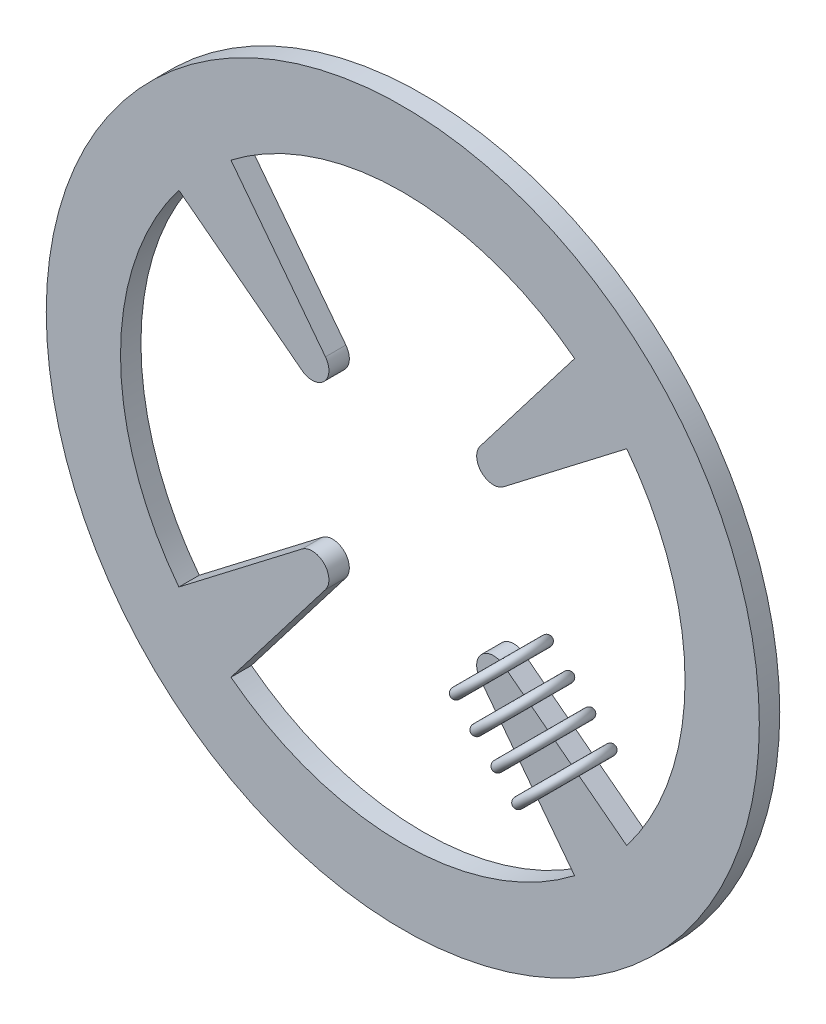
ISO-10303-21;
HEADER;
FILE_DESCRIPTION(('STEP AP214'),'2;1');
FILE_NAME('part.step','',(''),(''),'','','');
FILE_SCHEMA(('AUTOMOTIVE_DESIGN { 1 0 10303 214 1 1 1 1 }'));
ENDSEC;
DATA;
#1=APPLICATION_CONTEXT('core data for automotive mechanical design processes');
#2=APPLICATION_PROTOCOL_DEFINITION('international standard','automotive_design',2000,#1);
#3=PRODUCT_CONTEXT('',#1,'mechanical');
#4=PRODUCT('Part','Part','',(#3));
#5=PRODUCT_RELATED_PRODUCT_CATEGORY('part','',(#4));
#6=PRODUCT_DEFINITION_FORMATION('','',#4);
#7=PRODUCT_DEFINITION_CONTEXT('part definition',#1,'design');
#8=PRODUCT_DEFINITION('design','',#6,#7);
#9=PRODUCT_DEFINITION_SHAPE('','',#8);
#10=(LENGTH_UNIT() NAMED_UNIT(*) SI_UNIT(.MILLI.,.METRE.));
#11=(NAMED_UNIT(*) PLANE_ANGLE_UNIT() SI_UNIT($,.RADIAN.));
#12=(NAMED_UNIT(*) SI_UNIT($,.STERADIAN.) SOLID_ANGLE_UNIT());
#13=UNCERTAINTY_MEASURE_WITH_UNIT(LENGTH_MEASURE(1.E-05),#10,'distance_accuracy_value','');
#14=(GEOMETRIC_REPRESENTATION_CONTEXT(3) GLOBAL_UNCERTAINTY_ASSIGNED_CONTEXT((#13)) GLOBAL_UNIT_ASSIGNED_CONTEXT((#10,
#11,#12)) REPRESENTATION_CONTEXT('',''));
#15=CARTESIAN_POINT('',(0.,0.,0.));
#16=DIRECTION('',(0.,0.,1.));
#17=DIRECTION('',(1.,0.,0.));
#18=AXIS2_PLACEMENT_3D('',#15,#16,#17);
#19=CARTESIAN_POINT('',(0.410121933062218,-0.410121933114174,0.0300000000095224));
#20=DIRECTION('',(0.707106781186549,-0.707106781186546,0.));
#21=DIRECTION('',(0.707106781186546,0.707106781186549,0.));
#22=AXIS2_PLACEMENT_3D('',#19,#20,#21);
#23=TOROIDAL_SURFACE('',#22,0.100656984994382,0.0132);
#24=CARTESIAN_POINT('',(0.481297169725538,-0.338946696450854,0.03));
#25=DIRECTION('',(0.,0.,1.));
#26=DIRECTION('',(1.,0.,0.));
#27=AXIS2_PLACEMENT_3D('',#24,#25,#26);
#28=CIRCLE('',#27,0.0132);
#29=CARTESIAN_POINT('',(0.4906309792372,-0.329612886939192,0.0299999999987512));
#30=VERTEX_POINT('',#29);
#31=EDGE_CURVE('E11',#30,#30,#28,.T.);
#32=CARTESIAN_POINT('',(0.410121933062218,-0.410121933114174,0.0300000000095224));
#33=DIRECTION('',(0.707106781186549,-0.707106781186546,0.));
#34=DIRECTION('',(0.707106781186546,0.707106781186549,0.));
#35=AXIS2_PLACEMENT_3D('',#32,#33,#34);
#36=CIRCLE('',#35,0.113856984994382);
#37=EDGE_CURVE('',#30,#30,#36,.T.);
#38=ORIENTED_EDGE('',*,*,#31,.T.);
#39=ORIENTED_EDGE('',*,*,#31,.F.);
#40=ORIENTED_EDGE('',*,*,#37,.T.);
#41=ORIENTED_EDGE('',*,*,#37,.F.);
#42=EDGE_LOOP('',(#38,#40,#39,#41));
#43=FACE_BOUND('',#42,.T.);
#44=ADVANCED_FACE('F54',(#43),#23,.T.);
#45=CLOSED_SHELL('',(#44));
#46=MANIFOLD_SOLID_BREP('B2',#45);
#47=CARTESIAN_POINT('',(0.29698484809835,-0.296984848098347,0.03));
#48=DIRECTION('',(0.707106781186549,-0.707106781186546,0.));
#49=DIRECTION('',(0.707106781186546,0.707106781186549,0.));
#50=AXIS2_PLACEMENT_3D('',#47,#48,#49);
#51=TOROIDAL_SURFACE('',#50,0.1,0.0132);
#52=CARTESIAN_POINT('',(0.367695526217005,-0.226274169979692,0.03));
#53=DIRECTION('',(0.,0.,1.));
#54=DIRECTION('',(1.,0.,0.));
#55=AXIS2_PLACEMENT_3D('',#52,#53,#54);
#56=CIRCLE('',#55,0.0132);
#57=CARTESIAN_POINT('',(0.377029335728667,-0.216940360468029,0.03));
#58=VERTEX_POINT('',#57);
#59=EDGE_CURVE('E53',#58,#58,#56,.T.);
#60=CARTESIAN_POINT('',(0.29698484809835,-0.296984848098347,0.03));
#61=DIRECTION('',(0.707106781186549,-0.707106781186546,0.));
#62=DIRECTION('',(0.707106781186546,0.707106781186549,0.));
#63=AXIS2_PLACEMENT_3D('',#60,#61,#62);
#64=CIRCLE('',#63,0.1132);
#65=EDGE_CURVE('',#58,#58,#64,.T.);
#66=ORIENTED_EDGE('',*,*,#59,.T.);
#67=ORIENTED_EDGE('',*,*,#59,.F.);
#68=ORIENTED_EDGE('',*,*,#65,.T.);
#69=ORIENTED_EDGE('',*,*,#65,.F.);
#70=EDGE_LOOP('',(#66,#68,#67,#69));
#71=FACE_BOUND('',#70,.T.);
#72=ADVANCED_FACE('F81',(#71),#51,.T.);
#73=CLOSED_SHELL('',(#72));
#74=MANIFOLD_SOLID_BREP('B6',#73);
#75=CARTESIAN_POINT('',(0.240416305603426,-0.240416305603423,0.0300000000047612));
#76=DIRECTION('',(0.707106781186547,-0.707106781186548,0.));
#77=DIRECTION('',(0.707106781186548,0.707106781186547,0.));
#78=AXIS2_PLACEMENT_3D('',#75,#76,#77);
#79=TOROIDAL_SURFACE('',#78,0.099243092589802,0.0132);
#80=CARTESIAN_POINT('',(0.308328717675985,-0.172503893530864,0.055));
#81=DIRECTION('',(-0.17812493610375,-0.17812493610375,0.967751525070392));
#82=DIRECTION('',(0.983479446782699,0.,0.181019826969301));
#83=AXIS2_PLACEMENT_3D('',#80,#81,#82);
#84=CIRCLE('',#83,0.0132);
#85=CARTESIAN_POINT('',(0.317361526065613,-0.163471085141236,0.0583251684457389));
#86=VERTEX_POINT('',#85);
#87=EDGE_CURVE('E80',#86,#86,#84,.T.);
#88=CARTESIAN_POINT('',(0.240416305603426,-0.240416305603423,0.0300000000047612));
#89=DIRECTION('',(0.707106781186547,-0.707106781186548,0.));
#90=DIRECTION('',(0.707106781186548,0.707106781186547,0.));
#91=AXIS2_PLACEMENT_3D('',#88,#89,#90);
#92=CIRCLE('',#91,0.112443092589802);
#93=EDGE_CURVE('',#86,#86,#92,.T.);
#94=ORIENTED_EDGE('',*,*,#87,.T.);
#95=ORIENTED_EDGE('',*,*,#87,.F.);
#96=ORIENTED_EDGE('',*,*,#93,.T.);
#97=ORIENTED_EDGE('',*,*,#93,.F.);
#98=EDGE_LOOP('',(#94,#96,#95,#97));
#99=FACE_BOUND('',#98,.T.);
#100=ADVANCED_FACE('F108',(#99),#79,.T.);
#101=CLOSED_SHELL('',(#100));
#102=MANIFOLD_SOLID_BREP('B48',#101);
#103=CARTESIAN_POINT('',(0.353553390593274,-0.35355339059327,0.03));
#104=DIRECTION('',(0.707106781186549,-0.707106781186546,0.));
#105=DIRECTION('',(0.707106781186546,0.707106781186549,0.));
#106=AXIS2_PLACEMENT_3D('',#103,#104,#105);
#107=TOROIDAL_SURFACE('',#106,0.1,0.0132);
#108=CARTESIAN_POINT('',(0.424264068711928,-0.282842712474616,0.03));
#109=DIRECTION('',(0.,0.,1.));
#110=DIRECTION('',(1.,0.,0.));
#111=AXIS2_PLACEMENT_3D('',#108,#109,#110);
#112=CIRCLE('',#111,0.0132);
#113=CARTESIAN_POINT('',(0.433597878223591,-0.273508902962953,0.03));
#114=VERTEX_POINT('',#113);
#115=EDGE_CURVE('E107',#114,#114,#112,.T.);
#116=CARTESIAN_POINT('',(0.353553390593274,-0.35355339059327,0.03));
#117=DIRECTION('',(0.707106781186549,-0.707106781186546,0.));
#118=DIRECTION('',(0.707106781186546,0.707106781186549,0.));
#119=AXIS2_PLACEMENT_3D('',#116,#117,#118);
#120=CIRCLE('',#119,0.1132);
#121=EDGE_CURVE('',#114,#114,#120,.T.);
#122=ORIENTED_EDGE('',*,*,#115,.T.);
#123=ORIENTED_EDGE('',*,*,#115,.F.);
#124=ORIENTED_EDGE('',*,*,#121,.T.);
#125=ORIENTED_EDGE('',*,*,#121,.F.);
#126=EDGE_LOOP('',(#122,#124,#123,#125));
#127=FACE_BOUND('',#126,.T.);
#128=ADVANCED_FACE('F135',(#127),#107,.T.);
#129=CLOSED_SHELL('',(#128));
#130=MANIFOLD_SOLID_BREP('B75',#129);
#131=CARTESIAN_POINT('',(0.,0.,0.055));
#132=DIRECTION('',(0.,0.,-1.));
#133=DIRECTION('',(-1.,0.,0.));
#134=AXIS2_PLACEMENT_3D('',#131,#132,#133);
#135=CYLINDRICAL_SURFACE('',#134,0.76);
#136=CARTESIAN_POINT('',(0.,0.,0.));
#137=DIRECTION('',(0.,0.,1.));
#138=DIRECTION('',(1.,0.,0.));
#139=AXIS2_PLACEMENT_3D('',#136,#137,#138);
#140=CIRCLE('',#139,0.76);
#141=CARTESIAN_POINT('',(-0.462658686046631,-0.602948538621336,0.));
#142=VERTEX_POINT('',#141);
#143=CARTESIAN_POINT('',(0.462658686046628,-0.602948538621339,0.));
#144=VERTEX_POINT('',#143);
#145=EDGE_CURVE('E429',#142,#144,#140,.T.);
#146=ORIENTED_EDGE('',*,*,#145,.F.);
#147=DIRECTION('',(0.,0.,1.));
#148=VECTOR('',#147,1.);
#149=CARTESIAN_POINT('',(-0.462658686046631,-0.602948538621336,0.));
#150=LINE('',#149,#148);
#151=CARTESIAN_POINT('',(-0.462658686046631,-0.602948538621336,0.055));
#152=VERTEX_POINT('',#151);
#153=EDGE_CURVE('E169',#142,#152,#150,.T.);
#154=ORIENTED_EDGE('',*,*,#153,.T.);
#155=CARTESIAN_POINT('',(0.,0.,0.055));
#156=DIRECTION('',(0.,0.,1.));
#157=DIRECTION('',(1.,0.,0.));
#158=AXIS2_PLACEMENT_3D('',#155,#156,#157);
#159=CIRCLE('',#158,0.76);
#160=CARTESIAN_POINT('',(0.462658686046628,-0.602948538621339,0.055));
#161=VERTEX_POINT('',#160);
#162=EDGE_CURVE('E426',#152,#161,#159,.T.);
#163=ORIENTED_EDGE('',*,*,#162,.T.);
#164=DIRECTION('',(0.,0.,1.));
#165=VECTOR('',#164,1.);
#166=CARTESIAN_POINT('',(0.462658686046628,-0.602948538621339,0.));
#167=LINE('',#166,#165);
#168=EDGE_CURVE('E339',#144,#161,#167,.T.);
#169=ORIENTED_EDGE('',*,*,#168,.F.);
#170=EDGE_LOOP('',(#146,#154,#163,#169));
#171=FACE_BOUND('',#170,.T.);
#172=ADVANCED_FACE('F153',(#171),#135,.F.);
#173=CARTESIAN_POINT('',(0.602948538621336,-0.462658686046631,0.));
#174=VERTEX_POINT('',#173);
#175=CARTESIAN_POINT('',(0.602948538621339,0.462658686046628,0.));
#176=VERTEX_POINT('',#175);
#177=EDGE_CURVE('E433',#174,#176,#140,.T.);
#178=ORIENTED_EDGE('',*,*,#177,.F.);
#179=DIRECTION('',(0.,0.,1.));
#180=VECTOR('',#179,1.);
#181=CARTESIAN_POINT('',(0.602948538621336,-0.462658686046631,0.));
#182=LINE('',#181,#180);
#183=CARTESIAN_POINT('',(0.602948538621336,-0.462658686046631,0.055));
#184=VERTEX_POINT('',#183);
#185=EDGE_CURVE('E177',#174,#184,#182,.T.);
#186=ORIENTED_EDGE('',*,*,#185,.T.);
#187=CARTESIAN_POINT('',(0.602948538621339,0.462658686046628,0.055));
#188=VERTEX_POINT('',#187);
#189=EDGE_CURVE('E432',#184,#188,#159,.T.);
#190=ORIENTED_EDGE('',*,*,#189,.T.);
#191=DIRECTION('',(0.,0.,1.));
#192=VECTOR('',#191,1.);
#193=CARTESIAN_POINT('',(0.602948538621339,0.462658686046628,0.));
#194=LINE('',#193,#192);
#195=EDGE_CURVE('E376',#176,#188,#194,.T.);
#196=ORIENTED_EDGE('',*,*,#195,.F.);
#197=EDGE_LOOP('',(#178,#186,#190,#196));
#198=FACE_BOUND('',#197,.T.);
#199=ADVANCED_FACE('F448',(#198),#135,.F.);
#200=CARTESIAN_POINT('',(0.462658686046631,0.602948538621336,0.));
#201=VERTEX_POINT('',#200);
#202=CARTESIAN_POINT('',(-0.462658686046628,0.602948538621339,0.));
#203=VERTEX_POINT('',#202);
#204=EDGE_CURVE('E412',#201,#203,#140,.T.);
#205=ORIENTED_EDGE('',*,*,#204,.F.);
#206=DIRECTION('',(0.,0.,1.));
#207=VECTOR('',#206,1.);
#208=CARTESIAN_POINT('',(0.462658686046631,0.602948538621336,0.));
#209=LINE('',#208,#207);
#210=CARTESIAN_POINT('',(0.462658686046631,0.602948538621336,0.055));
#211=VERTEX_POINT('',#210);
#212=EDGE_CURVE('E371',#201,#211,#209,.T.);
#213=ORIENTED_EDGE('',*,*,#212,.T.);
#214=CARTESIAN_POINT('',(-0.462658686046628,0.602948538621339,0.055));
#215=VERTEX_POINT('',#214);
#216=EDGE_CURVE('E427',#211,#215,#159,.T.);
#217=ORIENTED_EDGE('',*,*,#216,.T.);
#218=DIRECTION('',(0.,0.,1.));
#219=VECTOR('',#218,1.);
#220=CARTESIAN_POINT('',(-0.462658686046628,0.602948538621339,0.));
#221=LINE('',#220,#219);
#222=EDGE_CURVE('E413',#203,#215,#221,.T.);
#223=ORIENTED_EDGE('',*,*,#222,.F.);
#224=EDGE_LOOP('',(#205,#213,#217,#223));
#225=FACE_BOUND('',#224,.T.);
#226=ADVANCED_FACE('F486',(#225),#135,.F.);
#227=DIRECTION('',(0.,0.,1.));
#228=VECTOR('',#227,1.);
#229=CARTESIAN_POINT('',(-0.602948538621339,-0.462658686046628,0.));
#230=LINE('',#229,#228);
#231=CARTESIAN_POINT('',(-0.602948538621339,-0.462658686046628,0.));
#232=VERTEX_POINT('',#231);
#233=CARTESIAN_POINT('',(-0.602948538621339,-0.462658686046628,0.055));
#234=VERTEX_POINT('',#233);
#235=EDGE_CURVE('E280',#232,#234,#230,.T.);
#236=ORIENTED_EDGE('',*,*,#235,.F.);
#237=CARTESIAN_POINT('',(-0.602948538621336,0.462658686046631,0.));
#238=VERTEX_POINT('',#237);
#239=EDGE_CURVE('E289',#238,#232,#140,.T.);
#240=ORIENTED_EDGE('',*,*,#239,.F.);
#241=DIRECTION('',(0.,0.,1.));
#242=VECTOR('',#241,1.);
#243=CARTESIAN_POINT('',(-0.602948538621336,0.462658686046631,0.));
#244=LINE('',#243,#242);
#245=CARTESIAN_POINT('',(-0.602948538621336,0.462658686046631,0.055));
#246=VERTEX_POINT('',#245);
#247=EDGE_CURVE('E408',#238,#246,#244,.T.);
#248=ORIENTED_EDGE('',*,*,#247,.T.);
#249=EDGE_CURVE('E422',#246,#234,#159,.T.);
#250=ORIENTED_EDGE('',*,*,#249,.T.);
#251=EDGE_LOOP('',(#236,#240,#248,#250));
#252=FACE_BOUND('',#251,.T.);
#253=ADVANCED_FACE('F470',(#252),#135,.F.);
#254=CARTESIAN_POINT('',(0.,0.,0.055));
#255=DIRECTION('',(0.,0.,1.));
#256=DIRECTION('',(1.,0.,0.));
#257=AXIS2_PLACEMENT_3D('',#254,#255,#256);
#258=PLANE('',#257);
#259=CARTESIAN_POINT('',(0.,0.,0.055));
#260=DIRECTION('',(0.,0.,1.));
#261=DIRECTION('',(1.,0.,0.));
#262=AXIS2_PLACEMENT_3D('',#259,#260,#261);
#263=CIRCLE('',#262,0.96);
#264=CARTESIAN_POINT('',(0.96,0.,0.055));
#265=VERTEX_POINT('',#264);
#266=EDGE_CURVE('E133',#265,#265,#263,.T.);
#267=ORIENTED_EDGE('',*,*,#266,.T.);
#268=EDGE_LOOP('',(#267));
#269=FACE_BOUND('',#268,.T.);
#270=ORIENTED_EDGE('',*,*,#249,.F.);
#271=DIRECTION('',(-0.793353340291235,0.60876142900872,0.));
#272=VECTOR('',#271,1.);
#273=CARTESIAN_POINT('',(0.,0.,0.055));
#274=LINE('',#273,#272);
#275=CARTESIAN_POINT('',(-0.271393831112811,0.208247810983869,0.055));
#276=VERTEX_POINT('',#275);
#277=EDGE_CURVE('E375',#276,#246,#274,.T.);
#278=ORIENTED_EDGE('',*,*,#277,.F.);
#279=CARTESIAN_POINT('',(-0.243977486679677,0.243977486679683,0.055));
#280=DIRECTION('',(0.,0.,1.));
#281=DIRECTION('',(1.,0.,0.));
#282=AXIS2_PLACEMENT_3D('',#279,#280,#281);
#283=CIRCLE('',#282,0.0450362705761065);
#284=CARTESIAN_POINT('',(-0.208247810983862,0.271393831112816,0.055));
#285=VERTEX_POINT('',#284);
#286=EDGE_CURVE('E401',#276,#285,#283,.T.);
#287=ORIENTED_EDGE('',*,*,#286,.T.);
#288=DIRECTION('',(-0.608761429008729,0.793353340291229,0.));
#289=VECTOR('',#288,1.);
#290=CARTESIAN_POINT('',(0.,0.,0.055));
#291=LINE('',#290,#289);
#292=EDGE_CURVE('E389',#285,#215,#291,.T.);
#293=ORIENTED_EDGE('',*,*,#292,.T.);
#294=ORIENTED_EDGE('',*,*,#216,.F.);
#295=DIRECTION('',(0.608761429008728,0.79335334029123,0.));
#296=VECTOR('',#295,1.);
#297=CARTESIAN_POINT('',(0.,0.,0.055));
#298=LINE('',#297,#296);
#299=CARTESIAN_POINT('',(0.208247810983866,0.271393831112813,0.055));
#300=VERTEX_POINT('',#299);
#301=EDGE_CURVE('E338',#300,#211,#298,.T.);
#302=ORIENTED_EDGE('',*,*,#301,.F.);
#303=CARTESIAN_POINT('',(0.24397748667968,0.243977486679679,0.055));
#304=DIRECTION('',(0.,0.,1.));
#305=DIRECTION('',(1.,0.,0.));
#306=AXIS2_PLACEMENT_3D('',#303,#304,#305);
#307=CIRCLE('',#306,0.0450362705761065);
#308=CARTESIAN_POINT('',(0.271393831112814,0.208247810983865,0.055));
#309=VERTEX_POINT('',#308);
#310=EDGE_CURVE('E364',#300,#309,#307,.T.);
#311=ORIENTED_EDGE('',*,*,#310,.T.);
#312=DIRECTION('',(0.793353340291234,0.608761429008722,0.));
#313=VECTOR('',#312,1.);
#314=CARTESIAN_POINT('',(0.,0.,0.055));
#315=LINE('',#314,#313);
#316=EDGE_CURVE('E353',#309,#188,#315,.T.);
#317=ORIENTED_EDGE('',*,*,#316,.T.);
#318=ORIENTED_EDGE('',*,*,#189,.F.);
#319=DIRECTION('',(0.793353340291232,-0.608761429008725,0.));
#320=VECTOR('',#319,1.);
#321=CARTESIAN_POINT('',(0.,0.,0.055));
#322=LINE('',#321,#320);
#323=CARTESIAN_POINT('',(0.271393831112813,-0.208247810983867,0.055));
#324=VERTEX_POINT('',#323);
#325=EDGE_CURVE('E309',#324,#184,#322,.T.);
#326=ORIENTED_EDGE('',*,*,#325,.F.);
#327=CARTESIAN_POINT('',(0.243977486679678,-0.243977486679681,0.055));
#328=DIRECTION('',(0.,0.,1.));
#329=DIRECTION('',(1.,0.,0.));
#330=AXIS2_PLACEMENT_3D('',#327,#328,#329);
#331=CIRCLE('',#330,0.0450362705761065);
#332=CARTESIAN_POINT('',(0.208247810983864,-0.271393831112815,0.055));
#333=VERTEX_POINT('',#332);
#334=EDGE_CURVE('E329',#324,#333,#331,.T.);
#335=ORIENTED_EDGE('',*,*,#334,.T.);
#336=DIRECTION('',(0.608761429008724,-0.793353340291233,0.));
#337=VECTOR('',#336,1.);
#338=CARTESIAN_POINT('',(0.,0.,0.055));
#339=LINE('',#338,#337);
#340=EDGE_CURVE('E318',#333,#161,#339,.T.);
#341=ORIENTED_EDGE('',*,*,#340,.T.);
#342=ORIENTED_EDGE('',*,*,#162,.F.);
#343=DIRECTION('',(-0.608761429008723,-0.793353340291233,0.));
#344=VECTOR('',#343,1.);
#345=CARTESIAN_POINT('',(0.,0.,0.055));
#346=LINE('',#345,#344);
#347=CARTESIAN_POINT('',(-0.208247810983868,-0.271393831112812,0.055));
#348=VERTEX_POINT('',#347);
#349=EDGE_CURVE('E295',#348,#152,#346,.T.);
#350=ORIENTED_EDGE('',*,*,#349,.F.);
#351=CARTESIAN_POINT('',(-0.243977486679682,-0.243977486679678,0.055));
#352=DIRECTION('',(0.,0.,1.));
#353=DIRECTION('',(1.,0.,0.));
#354=AXIS2_PLACEMENT_3D('',#351,#352,#353);
#355=CIRCLE('',#354,0.0450362705761065);
#356=CARTESIAN_POINT('',(-0.271393831112815,-0.208247810983863,0.055));
#357=VERTEX_POINT('',#356);
#358=EDGE_CURVE('E302',#348,#357,#355,.T.);
#359=ORIENTED_EDGE('',*,*,#358,.T.);
#360=DIRECTION('',(-0.793353340291231,-0.608761429008727,0.));
#361=VECTOR('',#360,1.);
#362=CARTESIAN_POINT('',(0.,0.,0.055));
#363=LINE('',#362,#361);
#364=EDGE_CURVE('E274',#357,#234,#363,.T.);
#365=ORIENTED_EDGE('',*,*,#364,.T.);
#366=EDGE_LOOP('',(#270,#278,#287,#293,#294,#302,#311,#317,#318,#326,#335,#341,#342,#350,#359,#365));
#367=FACE_BOUND('',#366,.T.);
#368=ADVANCED_FACE('F463',(#269,#367),#258,.T.);
#369=CARTESIAN_POINT('',(0.,0.,0.));
#370=DIRECTION('',(0.,0.,1.));
#371=DIRECTION('',(1.,0.,0.));
#372=AXIS2_PLACEMENT_3D('',#369,#370,#371);
#373=PLANE('',#372);
#374=CARTESIAN_POINT('',(0.,0.,0.));
#375=DIRECTION('',(0.,0.,1.));
#376=DIRECTION('',(1.,0.,0.));
#377=AXIS2_PLACEMENT_3D('',#374,#375,#376);
#378=CIRCLE('',#377,0.96);
#379=CARTESIAN_POINT('',(0.96,0.,0.));
#380=VERTEX_POINT('',#379);
#381=EDGE_CURVE('E157',#380,#380,#378,.T.);
#382=ORIENTED_EDGE('',*,*,#381,.F.);
#383=EDGE_LOOP('',(#382));
#384=FACE_BOUND('',#383,.T.);
#385=ORIENTED_EDGE('',*,*,#239,.T.);
#386=DIRECTION('',(-0.793353340291231,-0.608761429008727,0.));
#387=VECTOR('',#386,1.);
#388=CARTESIAN_POINT('',(0.,0.,0.));
#389=LINE('',#388,#387);
#390=CARTESIAN_POINT('',(-0.271393831112815,-0.208247810983863,0.));
#391=VERTEX_POINT('',#390);
#392=EDGE_CURVE('E271',#391,#232,#389,.T.);
#393=ORIENTED_EDGE('',*,*,#392,.F.);
#394=CARTESIAN_POINT('',(-0.243977486679682,-0.243977486679678,0.));
#395=DIRECTION('',(0.,0.,1.));
#396=DIRECTION('',(1.,0.,0.));
#397=AXIS2_PLACEMENT_3D('',#394,#395,#396);
#398=CIRCLE('',#397,0.0450362705761065);
#399=CARTESIAN_POINT('',(-0.208247810983868,-0.271393831112812,0.));
#400=VERTEX_POINT('',#399);
#401=EDGE_CURVE('E287',#400,#391,#398,.T.);
#402=ORIENTED_EDGE('',*,*,#401,.F.);
#403=DIRECTION('',(-0.608761429008723,-0.793353340291233,0.));
#404=VECTOR('',#403,1.);
#405=CARTESIAN_POINT('',(0.,0.,0.));
#406=LINE('',#405,#404);
#407=EDGE_CURVE('E281',#400,#142,#406,.T.);
#408=ORIENTED_EDGE('',*,*,#407,.T.);
#409=ORIENTED_EDGE('',*,*,#145,.T.);
#410=DIRECTION('',(0.608761429008724,-0.793353340291233,0.));
#411=VECTOR('',#410,1.);
#412=CARTESIAN_POINT('',(0.,0.,0.));
#413=LINE('',#412,#411);
#414=CARTESIAN_POINT('',(0.208247810983864,-0.271393831112815,0.));
#415=VERTEX_POINT('',#414);
#416=EDGE_CURVE('E322',#415,#144,#413,.T.);
#417=ORIENTED_EDGE('',*,*,#416,.F.);
#418=CARTESIAN_POINT('',(0.243977486679678,-0.243977486679681,0.));
#419=DIRECTION('',(0.,0.,1.));
#420=DIRECTION('',(1.,0.,0.));
#421=AXIS2_PLACEMENT_3D('',#418,#419,#420);
#422=CIRCLE('',#421,0.0450362705761065);
#423=CARTESIAN_POINT('',(0.271393831112813,-0.208247810983867,0.));
#424=VERTEX_POINT('',#423);
#425=EDGE_CURVE('E317',#424,#415,#422,.T.);
#426=ORIENTED_EDGE('',*,*,#425,.F.);
#427=DIRECTION('',(0.793353340291232,-0.608761429008725,0.));
#428=VECTOR('',#427,1.);
#429=CARTESIAN_POINT('',(0.,0.,0.));
#430=LINE('',#429,#428);
#431=EDGE_CURVE('E314',#424,#174,#430,.T.);
#432=ORIENTED_EDGE('',*,*,#431,.T.);
#433=ORIENTED_EDGE('',*,*,#177,.T.);
#434=DIRECTION('',(0.793353340291234,0.608761429008722,0.));
#435=VECTOR('',#434,1.);
#436=CARTESIAN_POINT('',(0.,0.,0.));
#437=LINE('',#436,#435);
#438=CARTESIAN_POINT('',(0.271393831112814,0.208247810983865,0.));
#439=VERTEX_POINT('',#438);
#440=EDGE_CURVE('E357',#439,#176,#437,.T.);
#441=ORIENTED_EDGE('',*,*,#440,.F.);
#442=CARTESIAN_POINT('',(0.24397748667968,0.243977486679679,0.));
#443=DIRECTION('',(0.,0.,1.));
#444=DIRECTION('',(1.,0.,0.));
#445=AXIS2_PLACEMENT_3D('',#442,#443,#444);
#446=CIRCLE('',#445,0.0450362705761065);
#447=CARTESIAN_POINT('',(0.208247810983866,0.271393831112813,0.));
#448=VERTEX_POINT('',#447);
#449=EDGE_CURVE('E352',#448,#439,#446,.T.);
#450=ORIENTED_EDGE('',*,*,#449,.F.);
#451=DIRECTION('',(0.608761429008728,0.79335334029123,0.));
#452=VECTOR('',#451,1.);
#453=CARTESIAN_POINT('',(0.,0.,0.));
#454=LINE('',#453,#452);
#455=EDGE_CURVE('E348',#448,#201,#454,.T.);
#456=ORIENTED_EDGE('',*,*,#455,.T.);
#457=ORIENTED_EDGE('',*,*,#204,.T.);
#458=DIRECTION('',(-0.608761429008729,0.793353340291229,0.));
#459=VECTOR('',#458,1.);
#460=CARTESIAN_POINT('',(0.,0.,0.));
#461=LINE('',#460,#459);
#462=CARTESIAN_POINT('',(-0.208247810983862,0.271393831112816,0.));
#463=VERTEX_POINT('',#462);
#464=EDGE_CURVE('E393',#463,#203,#461,.T.);
#465=ORIENTED_EDGE('',*,*,#464,.F.);
#466=CARTESIAN_POINT('',(-0.243977486679677,0.243977486679683,0.));
#467=DIRECTION('',(0.,0.,1.));
#468=DIRECTION('',(1.,0.,0.));
#469=AXIS2_PLACEMENT_3D('',#466,#467,#468);
#470=CIRCLE('',#469,0.0450362705761065);
#471=CARTESIAN_POINT('',(-0.271393831112811,0.208247810983869,0.));
#472=VERTEX_POINT('',#471);
#473=EDGE_CURVE('E388',#472,#463,#470,.T.);
#474=ORIENTED_EDGE('',*,*,#473,.F.);
#475=DIRECTION('',(-0.793353340291235,0.60876142900872,0.));
#476=VECTOR('',#475,1.);
#477=CARTESIAN_POINT('',(0.,0.,0.));
#478=LINE('',#477,#476);
#479=EDGE_CURVE('E385',#472,#238,#478,.T.);
#480=ORIENTED_EDGE('',*,*,#479,.T.);
#481=EDGE_LOOP('',(#385,#393,#402,#408,#409,#417,#426,#432,#433,#441,#450,#456,#457,#465,#474,#480));
#482=FACE_BOUND('',#481,.T.);
#483=ADVANCED_FACE('F286',(#384,#482),#373,.F.);
#484=CARTESIAN_POINT('',(0.,0.,0.055));
#485=DIRECTION('',(0.,0.,-1.));
#486=DIRECTION('',(-1.,0.,0.));
#487=AXIS2_PLACEMENT_3D('',#484,#485,#486);
#488=CYLINDRICAL_SURFACE('',#487,0.96);
#489=ORIENTED_EDGE('',*,*,#266,.F.);
#490=EDGE_LOOP('',(#489));
#491=FACE_BOUND('',#490,.T.);
#492=ORIENTED_EDGE('',*,*,#381,.T.);
#493=EDGE_LOOP('',(#492));
#494=FACE_BOUND('',#493,.T.);
#495=ADVANCED_FACE('F155',(#491,#494),#488,.T.);
#496=CARTESIAN_POINT('',(0.,0.,0.));
#497=DIRECTION('',(0.60876142900872,0.793353340291235,0.));
#498=DIRECTION('',(-0.793353340291235,0.60876142900872,0.));
#499=AXIS2_PLACEMENT_3D('',#496,#497,#498);
#500=PLANE('',#499);
#501=ORIENTED_EDGE('',*,*,#277,.T.);
#502=ORIENTED_EDGE('',*,*,#247,.F.);
#503=ORIENTED_EDGE('',*,*,#479,.F.);
#504=DIRECTION('',(0.,0.,1.));
#505=VECTOR('',#504,1.);
#506=CARTESIAN_POINT('',(-0.271393831112811,0.208247810983869,0.));
#507=LINE('',#506,#505);
#508=EDGE_CURVE('E397',#472,#276,#507,.T.);
#509=ORIENTED_EDGE('',*,*,#508,.T.);
#510=EDGE_LOOP('',(#501,#502,#503,#509));
#511=FACE_BOUND('',#510,.T.);
#512=ADVANCED_FACE('F474',(#511),#500,.F.);
#513=CARTESIAN_POINT('',(0.,0.,0.));
#514=DIRECTION('',(0.793353340291229,0.608761429008729,0.));
#515=DIRECTION('',(-0.608761429008729,0.793353340291229,0.));
#516=AXIS2_PLACEMENT_3D('',#513,#514,#515);
#517=PLANE('',#516);
#518=ORIENTED_EDGE('',*,*,#292,.F.);
#519=DIRECTION('',(0.,0.,1.));
#520=VECTOR('',#519,1.);
#521=CARTESIAN_POINT('',(-0.208247810983862,0.271393831112816,0.));
#522=LINE('',#521,#520);
#523=EDGE_CURVE('E417',#463,#285,#522,.T.);
#524=ORIENTED_EDGE('',*,*,#523,.F.);
#525=ORIENTED_EDGE('',*,*,#464,.T.);
#526=ORIENTED_EDGE('',*,*,#222,.T.);
#527=EDGE_LOOP('',(#518,#524,#525,#526));
#528=FACE_BOUND('',#527,.T.);
#529=ADVANCED_FACE('F481',(#528),#517,.T.);
#530=CARTESIAN_POINT('',(-0.243977486679677,0.243977486679683,0.));
#531=DIRECTION('',(0.,0.,1.));
#532=DIRECTION('',(1.,0.,0.));
#533=AXIS2_PLACEMENT_3D('',#530,#531,#532);
#534=CYLINDRICAL_SURFACE('',#533,0.0450362705761065);
#535=ORIENTED_EDGE('',*,*,#286,.F.);
#536=ORIENTED_EDGE('',*,*,#508,.F.);
#537=ORIENTED_EDGE('',*,*,#473,.T.);
#538=ORIENTED_EDGE('',*,*,#523,.T.);
#539=EDGE_LOOP('',(#535,#536,#537,#538));
#540=FACE_BOUND('',#539,.T.);
#541=ADVANCED_FACE('F477',(#540),#534,.T.);
#542=CARTESIAN_POINT('',(0.,0.,0.));
#543=DIRECTION('',(0.79335334029123,-0.608761429008728,0.));
#544=DIRECTION('',(0.608761429008728,0.79335334029123,0.));
#545=AXIS2_PLACEMENT_3D('',#542,#543,#544);
#546=PLANE('',#545);
#547=ORIENTED_EDGE('',*,*,#301,.T.);
#548=ORIENTED_EDGE('',*,*,#212,.F.);
#549=ORIENTED_EDGE('',*,*,#455,.F.);
#550=DIRECTION('',(0.,0.,1.));
#551=VECTOR('',#550,1.);
#552=CARTESIAN_POINT('',(0.208247810983866,0.271393831112813,0.));
#553=LINE('',#552,#551);
#554=EDGE_CURVE('E361',#448,#300,#553,.T.);
#555=ORIENTED_EDGE('',*,*,#554,.T.);
#556=EDGE_LOOP('',(#547,#548,#549,#555));
#557=FACE_BOUND('',#556,.T.);
#558=ADVANCED_FACE('F489',(#557),#546,.F.);
#559=CARTESIAN_POINT('',(0.,0.,0.));
#560=DIRECTION('',(0.608761429008722,-0.793353340291234,0.));
#561=DIRECTION('',(0.793353340291234,0.608761429008722,0.));
#562=AXIS2_PLACEMENT_3D('',#559,#560,#561);
#563=PLANE('',#562);
#564=ORIENTED_EDGE('',*,*,#316,.F.);
#565=DIRECTION('',(0.,0.,1.));
#566=VECTOR('',#565,1.);
#567=CARTESIAN_POINT('',(0.271393831112814,0.208247810983865,0.));
#568=LINE('',#567,#566);
#569=EDGE_CURVE('E380',#439,#309,#568,.T.);
#570=ORIENTED_EDGE('',*,*,#569,.F.);
#571=ORIENTED_EDGE('',*,*,#440,.T.);
#572=ORIENTED_EDGE('',*,*,#195,.T.);
#573=EDGE_LOOP('',(#564,#570,#571,#572));
#574=FACE_BOUND('',#573,.T.);
#575=ADVANCED_FACE('F447',(#574),#563,.T.);
#576=CARTESIAN_POINT('',(0.24397748667968,0.243977486679679,0.));
#577=DIRECTION('',(0.,0.,1.));
#578=DIRECTION('',(1.,0.,0.));
#579=AXIS2_PLACEMENT_3D('',#576,#577,#578);
#580=CYLINDRICAL_SURFACE('',#579,0.0450362705761065);
#581=ORIENTED_EDGE('',*,*,#310,.F.);
#582=ORIENTED_EDGE('',*,*,#554,.F.);
#583=ORIENTED_EDGE('',*,*,#449,.T.);
#584=ORIENTED_EDGE('',*,*,#569,.T.);
#585=EDGE_LOOP('',(#581,#582,#583,#584));
#586=FACE_BOUND('',#585,.T.);
#587=ADVANCED_FACE('F491',(#586),#580,.T.);
#588=CARTESIAN_POINT('',(0.,0.,0.));
#589=DIRECTION('',(-0.608761429008725,-0.793353340291232,0.));
#590=DIRECTION('',(0.793353340291232,-0.608761429008725,0.));
#591=AXIS2_PLACEMENT_3D('',#588,#589,#590);
#592=PLANE('',#591);
#593=ORIENTED_EDGE('',*,*,#325,.T.);
#594=ORIENTED_EDGE('',*,*,#185,.F.);
#595=ORIENTED_EDGE('',*,*,#431,.F.);
#596=DIRECTION('',(0.,0.,1.));
#597=VECTOR('',#596,1.);
#598=CARTESIAN_POINT('',(0.271393831112813,-0.208247810983867,0.));
#599=LINE('',#598,#597);
#600=EDGE_CURVE('E326',#424,#324,#599,.T.);
#601=ORIENTED_EDGE('',*,*,#600,.T.);
#602=EDGE_LOOP('',(#593,#594,#595,#601));
#603=FACE_BOUND('',#602,.T.);
#604=ADVANCED_FACE('F493',(#603),#592,.F.);
#605=CARTESIAN_POINT('',(0.,0.,0.));
#606=DIRECTION('',(-0.793353340291233,-0.608761429008724,0.));
#607=DIRECTION('',(0.608761429008724,-0.793353340291233,0.));
#608=AXIS2_PLACEMENT_3D('',#605,#606,#607);
#609=PLANE('',#608);
#610=ORIENTED_EDGE('',*,*,#340,.F.);
#611=DIRECTION('',(0.,0.,1.));
#612=VECTOR('',#611,1.);
#613=CARTESIAN_POINT('',(0.208247810983864,-0.271393831112815,0.));
#614=LINE('',#613,#612);
#615=EDGE_CURVE('E343',#415,#333,#614,.T.);
#616=ORIENTED_EDGE('',*,*,#615,.F.);
#617=ORIENTED_EDGE('',*,*,#416,.T.);
#618=ORIENTED_EDGE('',*,*,#168,.T.);
#619=EDGE_LOOP('',(#610,#616,#617,#618));
#620=FACE_BOUND('',#619,.T.);
#621=ADVANCED_FACE('F461',(#620),#609,.T.);
#622=CARTESIAN_POINT('',(0.243977486679678,-0.243977486679681,0.));
#623=DIRECTION('',(0.,0.,1.));
#624=DIRECTION('',(1.,0.,0.));
#625=AXIS2_PLACEMENT_3D('',#622,#623,#624);
#626=CYLINDRICAL_SURFACE('',#625,0.0450362705761065);
#627=ORIENTED_EDGE('',*,*,#334,.F.);
#628=ORIENTED_EDGE('',*,*,#600,.F.);
#629=ORIENTED_EDGE('',*,*,#425,.T.);
#630=ORIENTED_EDGE('',*,*,#615,.T.);
#631=EDGE_LOOP('',(#627,#628,#629,#630));
#632=FACE_BOUND('',#631,.T.);
#633=ADVANCED_FACE('F466',(#632),#626,.T.);
#634=CARTESIAN_POINT('',(-0.243977486679682,-0.243977486679678,0.));
#635=DIRECTION('',(0.,0.,1.));
#636=DIRECTION('',(1.,0.,0.));
#637=AXIS2_PLACEMENT_3D('',#634,#635,#636);
#638=CYLINDRICAL_SURFACE('',#637,0.0450362705761065);
#639=ORIENTED_EDGE('',*,*,#358,.F.);
#640=DIRECTION('',(0.,0.,1.));
#641=VECTOR('',#640,1.);
#642=CARTESIAN_POINT('',(-0.208247810983868,-0.271393831112812,0.));
#643=LINE('',#642,#641);
#644=EDGE_CURVE('E293',#400,#348,#643,.T.);
#645=ORIENTED_EDGE('',*,*,#644,.F.);
#646=ORIENTED_EDGE('',*,*,#401,.T.);
#647=DIRECTION('',(0.,0.,1.));
#648=VECTOR('',#647,1.);
#649=CARTESIAN_POINT('',(-0.271393831112815,-0.208247810983863,0.));
#650=LINE('',#649,#648);
#651=EDGE_CURVE('E268',#391,#357,#650,.T.);
#652=ORIENTED_EDGE('',*,*,#651,.T.);
#653=EDGE_LOOP('',(#639,#645,#646,#652));
#654=FACE_BOUND('',#653,.T.);
#655=ADVANCED_FACE('F292',(#654),#638,.T.);
#656=CARTESIAN_POINT('',(0.,0.,0.));
#657=DIRECTION('',(-0.793353340291233,0.608761429008723,0.));
#658=DIRECTION('',(-0.608761429008723,-0.793353340291233,0.));
#659=AXIS2_PLACEMENT_3D('',#656,#657,#658);
#660=PLANE('',#659);
#661=ORIENTED_EDGE('',*,*,#349,.T.);
#662=ORIENTED_EDGE('',*,*,#153,.F.);
#663=ORIENTED_EDGE('',*,*,#407,.F.);
#664=ORIENTED_EDGE('',*,*,#644,.T.);
#665=EDGE_LOOP('',(#661,#662,#663,#664));
#666=FACE_BOUND('',#665,.T.);
#667=ADVANCED_FACE('F467',(#666),#660,.F.);
#668=CARTESIAN_POINT('',(0.,0.,0.));
#669=DIRECTION('',(-0.608761429008727,0.793353340291231,0.));
#670=DIRECTION('',(-0.793353340291231,-0.608761429008727,0.));
#671=AXIS2_PLACEMENT_3D('',#668,#669,#670);
#672=PLANE('',#671);
#673=ORIENTED_EDGE('',*,*,#364,.F.);
#674=ORIENTED_EDGE('',*,*,#651,.F.);
#675=ORIENTED_EDGE('',*,*,#392,.T.);
#676=ORIENTED_EDGE('',*,*,#235,.T.);
#677=EDGE_LOOP('',(#673,#674,#675,#676));
#678=FACE_BOUND('',#677,.T.);
#679=ADVANCED_FACE('F270',(#678),#672,.T.);
#680=CLOSED_SHELL('',(#172,#199,#226,#253,#368,#483,#495,#512,#529,#541,#558,#575,#587,#604,
#621,#633,#655,#667,#679));
#681=MANIFOLD_SOLID_BREP('B102',#680);
#682=ADVANCED_BREP_SHAPE_REPRESENTATION('',(#18,#46,#74,#102,#130,#681),#14);
#683=SHAPE_DEFINITION_REPRESENTATION(#9,#682);
ENDSEC;
END-ISO-10303-21;
